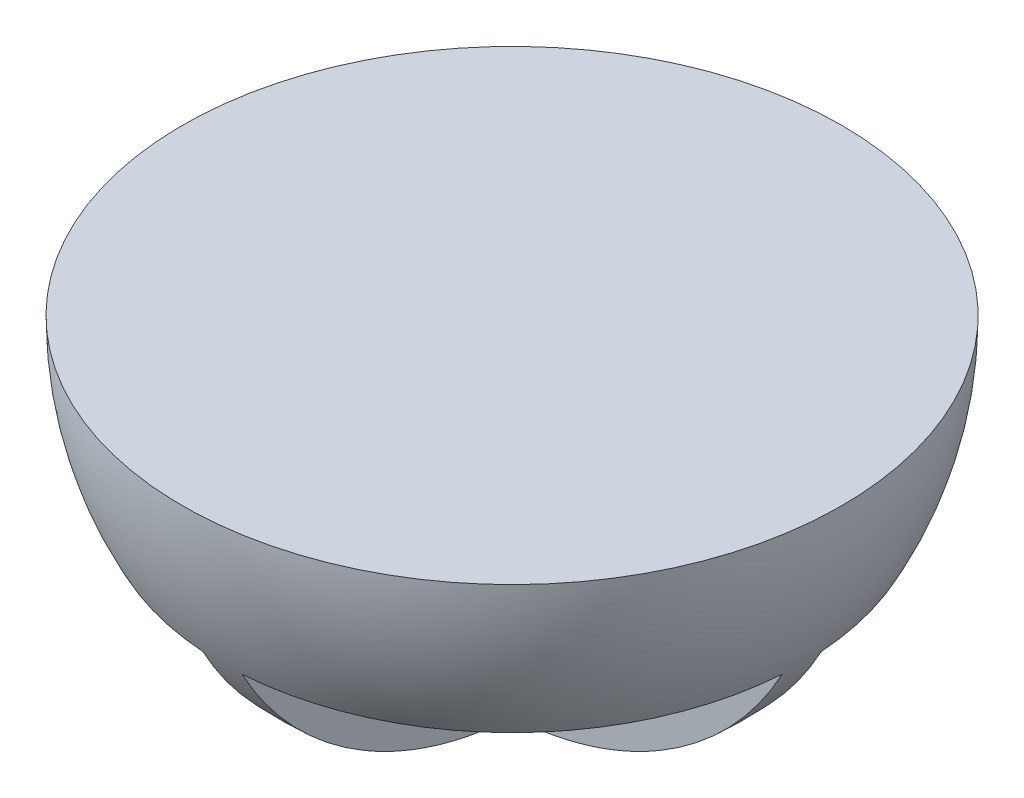
ISO-10303-21;
HEADER;
FILE_DESCRIPTION(('STEP AP214'),'2;1');
FILE_NAME('part.step','',(''),(''),'','','');
FILE_SCHEMA(('AUTOMOTIVE_DESIGN { 1 0 10303 214 1 1 1 1 }'));
ENDSEC;
DATA;
#1=APPLICATION_CONTEXT('core data for automotive mechanical design processes');
#2=APPLICATION_PROTOCOL_DEFINITION('international standard','automotive_design',2000,#1);
#3=PRODUCT_CONTEXT('',#1,'mechanical');
#4=PRODUCT('Part','Part','',(#3));
#5=PRODUCT_RELATED_PRODUCT_CATEGORY('part','',(#4));
#6=PRODUCT_DEFINITION_FORMATION('','',#4);
#7=PRODUCT_DEFINITION_CONTEXT('part definition',#1,'design');
#8=PRODUCT_DEFINITION('design','',#6,#7);
#9=PRODUCT_DEFINITION_SHAPE('','',#8);
#10=(LENGTH_UNIT() NAMED_UNIT(*) SI_UNIT(.MILLI.,.METRE.));
#11=(NAMED_UNIT(*) PLANE_ANGLE_UNIT() SI_UNIT($,.RADIAN.));
#12=(NAMED_UNIT(*) SI_UNIT($,.STERADIAN.) SOLID_ANGLE_UNIT());
#13=UNCERTAINTY_MEASURE_WITH_UNIT(LENGTH_MEASURE(1.E-05),#10,'distance_accuracy_value','');
#14=(GEOMETRIC_REPRESENTATION_CONTEXT(3) GLOBAL_UNCERTAINTY_ASSIGNED_CONTEXT((#13)) GLOBAL_UNIT_ASSIGNED_CONTEXT((#10,
#11,#12)) REPRESENTATION_CONTEXT('',''));
#15=CARTESIAN_POINT('',(0.,0.,0.));
#16=DIRECTION('',(0.,0.,1.));
#17=DIRECTION('',(1.,0.,0.));
#18=AXIS2_PLACEMENT_3D('',#15,#16,#17);
#19=CARTESIAN_POINT('',(0.,0.,0.));
#20=DIRECTION('',(0.,-1.,0.));
#21=DIRECTION('',(-1.,0.,0.));
#22=AXIS2_PLACEMENT_3D('',#19,#20,#21);
#23=SPHERICAL_SURFACE('',#22,33.8);
#24=CARTESIAN_POINT('',(0.,-33.791677969583,0.));
#25=DIRECTION('',(0.,1.,0.));
#26=DIRECTION('',(0.,0.,1.));
#27=AXIS2_PLACEMENT_3D('',#24,#25,#26);
#28=CIRCLE('',#27,0.75);
#29=CARTESIAN_POINT('',(0.,-33.791677969583,0.75));
#30=VERTEX_POINT('',#29);
#31=EDGE_CURVE('E158',#30,#30,#28,.T.);
#32=ORIENTED_EDGE('',*,*,#31,.T.);
#33=EDGE_LOOP('',(#32));
#34=FACE_BOUND('',#33,.T.);
#35=CARTESIAN_POINT('',(2.,0.,0.));
#36=DIRECTION('',(-1.,0.,0.));
#37=DIRECTION('',(0.,0.,1.));
#38=AXIS2_PLACEMENT_3D('',#35,#36,#37);
#39=CIRCLE('',#38,33.7407765174425);
#40=CARTESIAN_POINT('',(2.,-16.,-29.7058916715186));
#41=VERTEX_POINT('',#40);
#42=CARTESIAN_POINT('',(2.,-33.6814488999508,-2.));
#43=VERTEX_POINT('',#42);
#44=EDGE_CURVE('E123',#41,#43,#39,.T.);
#45=ORIENTED_EDGE('',*,*,#44,.T.);
#46=CARTESIAN_POINT('',(0.,0.,-2.));
#47=DIRECTION('',(0.,0.,1.));
#48=DIRECTION('',(1.,0.,0.));
#49=AXIS2_PLACEMENT_3D('',#46,#47,#48);
#50=CIRCLE('',#49,33.7407765174425);
#51=CARTESIAN_POINT('',(29.7058916715186,-16.,-2.));
#52=VERTEX_POINT('',#51);
#53=EDGE_CURVE('E119',#43,#52,#50,.T.);
#54=ORIENTED_EDGE('',*,*,#53,.T.);
#55=CARTESIAN_POINT('',(0.,-16.,0.));
#56=DIRECTION('',(0.,1.,0.));
#57=DIRECTION('',(0.,0.,1.));
#58=AXIS2_PLACEMENT_3D('',#55,#56,#57);
#59=CIRCLE('',#58,29.7731422594257);
#60=EDGE_CURVE('E104',#52,#41,#59,.T.);
#61=ORIENTED_EDGE('',*,*,#60,.T.);
#62=EDGE_LOOP('',(#45,#54,#61));
#63=FACE_BOUND('',#62,.T.);
#64=CARTESIAN_POINT('',(0.,0.,0.));
#65=DIRECTION('',(0.,-1.,0.));
#66=DIRECTION('',(0.,0.,-1.));
#67=AXIS2_PLACEMENT_3D('',#64,#65,#66);
#68=CIRCLE('',#67,33.8);
#69=CARTESIAN_POINT('',(0.,0.,-33.8));
#70=VERTEX_POINT('',#69);
#71=EDGE_CURVE('E11',#70,#70,#68,.T.);
#72=ORIENTED_EDGE('',*,*,#71,.T.);
#73=EDGE_LOOP('',(#72));
#74=FACE_BOUND('',#73,.T.);
#75=CARTESIAN_POINT('',(0.,0.,-2.));
#76=DIRECTION('',(0.,0.,1.));
#77=DIRECTION('',(1.,0.,0.));
#78=AXIS2_PLACEMENT_3D('',#75,#76,#77);
#79=CIRCLE('',#78,33.7407765174425);
#80=CARTESIAN_POINT('',(-29.7058916715186,-16.,-2.));
#81=VERTEX_POINT('',#80);
#82=CARTESIAN_POINT('',(-2.,-33.6814488999508,-2.));
#83=VERTEX_POINT('',#82);
#84=EDGE_CURVE('E114',#81,#83,#79,.T.);
#85=ORIENTED_EDGE('',*,*,#84,.T.);
#86=CARTESIAN_POINT('',(-2.,0.,0.));
#87=DIRECTION('',(-1.,0.,0.));
#88=DIRECTION('',(0.,0.,1.));
#89=AXIS2_PLACEMENT_3D('',#86,#87,#88);
#90=CIRCLE('',#89,33.7407765174425);
#91=CARTESIAN_POINT('',(-2.,-16.,-29.7058916715186));
#92=VERTEX_POINT('',#91);
#93=EDGE_CURVE('E163',#92,#83,#90,.T.);
#94=ORIENTED_EDGE('',*,*,#93,.F.);
#95=CARTESIAN_POINT('',(0.,-16.,0.));
#96=DIRECTION('',(0.,1.,0.));
#97=DIRECTION('',(0.,0.,1.));
#98=AXIS2_PLACEMENT_3D('',#95,#96,#97);
#99=CIRCLE('',#98,29.7731422594257);
#100=EDGE_CURVE('E45',#92,#81,#99,.T.);
#101=ORIENTED_EDGE('',*,*,#100,.T.);
#102=EDGE_LOOP('',(#85,#94,#101));
#103=FACE_BOUND('',#102,.T.);
#104=CARTESIAN_POINT('',(0.,-16.,0.));
#105=DIRECTION('',(0.,1.,0.));
#106=DIRECTION('',(0.,0.,1.));
#107=AXIS2_PLACEMENT_3D('',#104,#105,#106);
#108=CIRCLE('',#107,29.7731422594257);
#109=CARTESIAN_POINT('',(2.,-16.,29.7058916715186));
#110=VERTEX_POINT('',#109);
#111=CARTESIAN_POINT('',(29.7058916715186,-16.,2.));
#112=VERTEX_POINT('',#111);
#113=EDGE_CURVE('E124',#110,#112,#108,.T.);
#114=ORIENTED_EDGE('',*,*,#113,.T.);
#115=CARTESIAN_POINT('',(0.,0.,2.));
#116=DIRECTION('',(0.,0.,1.));
#117=DIRECTION('',(1.,0.,0.));
#118=AXIS2_PLACEMENT_3D('',#115,#116,#117);
#119=CIRCLE('',#118,33.7407765174425);
#120=CARTESIAN_POINT('',(2.,-33.6814488999508,2.));
#121=VERTEX_POINT('',#120);
#122=EDGE_CURVE('E136',#121,#112,#119,.T.);
#123=ORIENTED_EDGE('',*,*,#122,.F.);
#124=CARTESIAN_POINT('',(2.,0.,0.));
#125=DIRECTION('',(-1.,0.,0.));
#126=DIRECTION('',(0.,0.,1.));
#127=AXIS2_PLACEMENT_3D('',#124,#125,#126);
#128=CIRCLE('',#127,33.7407765174425);
#129=EDGE_CURVE('E133',#121,#110,#128,.T.);
#130=ORIENTED_EDGE('',*,*,#129,.T.);
#131=EDGE_LOOP('',(#114,#123,#130));
#132=FACE_BOUND('',#131,.T.);
#133=CARTESIAN_POINT('',(-2.,0.,0.));
#134=DIRECTION('',(-1.,0.,0.));
#135=DIRECTION('',(0.,0.,1.));
#136=AXIS2_PLACEMENT_3D('',#133,#134,#135);
#137=CIRCLE('',#136,33.7407765174425);
#138=CARTESIAN_POINT('',(-2.,-33.6814488999508,2.));
#139=VERTEX_POINT('',#138);
#140=CARTESIAN_POINT('',(-2.,-16.,29.7058916715186));
#141=VERTEX_POINT('',#140);
#142=EDGE_CURVE('E144',#139,#141,#137,.T.);
#143=ORIENTED_EDGE('',*,*,#142,.F.);
#144=CARTESIAN_POINT('',(0.,0.,2.));
#145=DIRECTION('',(0.,0.,1.));
#146=DIRECTION('',(1.,0.,0.));
#147=AXIS2_PLACEMENT_3D('',#144,#145,#146);
#148=CIRCLE('',#147,33.7407765174425);
#149=CARTESIAN_POINT('',(-29.7058916715186,-16.,2.));
#150=VERTEX_POINT('',#149);
#151=EDGE_CURVE('E146',#150,#139,#148,.T.);
#152=ORIENTED_EDGE('',*,*,#151,.F.);
#153=CARTESIAN_POINT('',(0.,-16.,0.));
#154=DIRECTION('',(0.,1.,0.));
#155=DIRECTION('',(0.,0.,1.));
#156=AXIS2_PLACEMENT_3D('',#153,#154,#155);
#157=CIRCLE('',#156,29.7731422594257);
#158=EDGE_CURVE('E137',#150,#141,#157,.T.);
#159=ORIENTED_EDGE('',*,*,#158,.T.);
#160=EDGE_LOOP('',(#143,#152,#159));
#161=FACE_BOUND('',#160,.T.);
#162=ADVANCED_FACE('F37',(#34,#63,#74,#103,#132,#161),#23,.T.);
#163=CARTESIAN_POINT('',(33.8,0.,0.));
#164=DIRECTION('',(0.,1.,0.));
#165=DIRECTION('',(0.,0.,1.));
#166=AXIS2_PLACEMENT_3D('',#163,#164,#165);
#167=PLANE('',#166);
#168=ORIENTED_EDGE('',*,*,#71,.F.);
#169=EDGE_LOOP('',(#168));
#170=FACE_BOUND('',#169,.T.);
#171=ADVANCED_FACE('F39',(#170),#167,.T.);
#172=CARTESIAN_POINT('',(-2.,-33.801,0.));
#173=DIRECTION('',(-1.,0.,0.));
#174=DIRECTION('',(0.,0.,1.));
#175=AXIS2_PLACEMENT_3D('',#172,#173,#174);
#176=PLANE('',#175);
#177=ORIENTED_EDGE('',*,*,#93,.T.);
#178=DIRECTION('',(0.,1.,0.));
#179=VECTOR('',#178,1.);
#180=CARTESIAN_POINT('',(-2.,-33.801,-2.));
#181=LINE('',#180,#179);
#182=CARTESIAN_POINT('',(-2.,-16.,-2.));
#183=VERTEX_POINT('',#182);
#184=EDGE_CURVE('E171',#83,#183,#181,.T.);
#185=ORIENTED_EDGE('',*,*,#184,.T.);
#186=DIRECTION('',(0.,0.,1.));
#187=VECTOR('',#186,1.);
#188=CARTESIAN_POINT('',(-2.,-16.,0.));
#189=LINE('',#188,#187);
#190=EDGE_CURVE('E168',#92,#183,#189,.T.);
#191=ORIENTED_EDGE('',*,*,#190,.F.);
#192=EDGE_LOOP('',(#177,#185,#191));
#193=FACE_BOUND('',#192,.T.);
#194=ADVANCED_FACE('F181',(#193),#176,.T.);
#195=CARTESIAN_POINT('',(0.,-33.801,-2.));
#196=DIRECTION('',(0.,0.,1.));
#197=DIRECTION('',(1.,0.,0.));
#198=AXIS2_PLACEMENT_3D('',#195,#196,#197);
#199=PLANE('',#198);
#200=DIRECTION('',(1.,0.,0.));
#201=VECTOR('',#200,1.);
#202=CARTESIAN_POINT('',(0.,-16.,-2.));
#203=LINE('',#202,#201);
#204=EDGE_CURVE('E165',#81,#183,#203,.T.);
#205=ORIENTED_EDGE('',*,*,#204,.T.);
#206=ORIENTED_EDGE('',*,*,#184,.F.);
#207=ORIENTED_EDGE('',*,*,#84,.F.);
#208=EDGE_LOOP('',(#205,#206,#207));
#209=FACE_BOUND('',#208,.T.);
#210=ADVANCED_FACE('F184',(#209),#199,.F.);
#211=CARTESIAN_POINT('',(0.,-16.,0.));
#212=DIRECTION('',(0.,1.,0.));
#213=DIRECTION('',(0.,0.,1.));
#214=AXIS2_PLACEMENT_3D('',#211,#212,#213);
#215=PLANE('',#214);
#216=ORIENTED_EDGE('',*,*,#190,.T.);
#217=ORIENTED_EDGE('',*,*,#204,.F.);
#218=ORIENTED_EDGE('',*,*,#100,.F.);
#219=EDGE_LOOP('',(#216,#217,#218));
#220=FACE_BOUND('',#219,.T.);
#221=ADVANCED_FACE('F179',(#220),#215,.F.);
#222=CARTESIAN_POINT('',(2.,-33.801,0.));
#223=DIRECTION('',(-1.,0.,0.));
#224=DIRECTION('',(0.,0.,1.));
#225=AXIS2_PLACEMENT_3D('',#222,#223,#224);
#226=PLANE('',#225);
#227=DIRECTION('',(0.,0.,1.));
#228=VECTOR('',#227,1.);
#229=CARTESIAN_POINT('',(2.,-16.,0.));
#230=LINE('',#229,#228);
#231=CARTESIAN_POINT('',(2.,-16.,-2.));
#232=VERTEX_POINT('',#231);
#233=EDGE_CURVE('E109',#41,#232,#230,.T.);
#234=ORIENTED_EDGE('',*,*,#233,.T.);
#235=DIRECTION('',(0.,1.,0.));
#236=VECTOR('',#235,1.);
#237=CARTESIAN_POINT('',(2.,-33.801,-2.));
#238=LINE('',#237,#236);
#239=EDGE_CURVE('E115',#43,#232,#238,.T.);
#240=ORIENTED_EDGE('',*,*,#239,.F.);
#241=ORIENTED_EDGE('',*,*,#44,.F.);
#242=EDGE_LOOP('',(#234,#240,#241));
#243=FACE_BOUND('',#242,.T.);
#244=ADVANCED_FACE('F191',(#243),#226,.F.);
#245=CARTESIAN_POINT('',(0.,-33.801,-2.));
#246=DIRECTION('',(0.,0.,1.));
#247=DIRECTION('',(1.,0.,0.));
#248=AXIS2_PLACEMENT_3D('',#245,#246,#247);
#249=PLANE('',#248);
#250=ORIENTED_EDGE('',*,*,#239,.T.);
#251=DIRECTION('',(1.,0.,0.));
#252=VECTOR('',#251,1.);
#253=CARTESIAN_POINT('',(0.,-16.,-2.));
#254=LINE('',#253,#252);
#255=EDGE_CURVE('E107',#232,#52,#254,.T.);
#256=ORIENTED_EDGE('',*,*,#255,.T.);
#257=ORIENTED_EDGE('',*,*,#53,.F.);
#258=EDGE_LOOP('',(#250,#256,#257));
#259=FACE_BOUND('',#258,.T.);
#260=ADVANCED_FACE('F118',(#259),#249,.F.);
#261=CARTESIAN_POINT('',(0.,-16.,0.));
#262=DIRECTION('',(0.,1.,0.));
#263=DIRECTION('',(0.,0.,1.));
#264=AXIS2_PLACEMENT_3D('',#261,#262,#263);
#265=PLANE('',#264);
#266=ORIENTED_EDGE('',*,*,#255,.F.);
#267=ORIENTED_EDGE('',*,*,#233,.F.);
#268=ORIENTED_EDGE('',*,*,#60,.F.);
#269=EDGE_LOOP('',(#266,#267,#268));
#270=FACE_BOUND('',#269,.T.);
#271=ADVANCED_FACE('F106',(#270),#265,.F.);
#272=CARTESIAN_POINT('',(0.,-33.801,2.));
#273=DIRECTION('',(0.,0.,1.));
#274=DIRECTION('',(1.,0.,0.));
#275=AXIS2_PLACEMENT_3D('',#272,#273,#274);
#276=PLANE('',#275);
#277=ORIENTED_EDGE('',*,*,#122,.T.);
#278=DIRECTION('',(1.,0.,0.));
#279=VECTOR('',#278,1.);
#280=CARTESIAN_POINT('',(0.,-16.,2.));
#281=LINE('',#280,#279);
#282=CARTESIAN_POINT('',(2.,-16.,2.));
#283=VERTEX_POINT('',#282);
#284=EDGE_CURVE('E60',#283,#112,#281,.T.);
#285=ORIENTED_EDGE('',*,*,#284,.F.);
#286=DIRECTION('',(0.,1.,0.));
#287=VECTOR('',#286,1.);
#288=CARTESIAN_POINT('',(2.,-33.801,2.));
#289=LINE('',#288,#287);
#290=EDGE_CURVE('E128',#121,#283,#289,.T.);
#291=ORIENTED_EDGE('',*,*,#290,.F.);
#292=EDGE_LOOP('',(#277,#285,#291));
#293=FACE_BOUND('',#292,.T.);
#294=ADVANCED_FACE('F226',(#293),#276,.T.);
#295=CARTESIAN_POINT('',(2.,-33.801,0.));
#296=DIRECTION('',(-1.,0.,0.));
#297=DIRECTION('',(0.,0.,1.));
#298=AXIS2_PLACEMENT_3D('',#295,#296,#297);
#299=PLANE('',#298);
#300=ORIENTED_EDGE('',*,*,#290,.T.);
#301=DIRECTION('',(0.,0.,1.));
#302=VECTOR('',#301,1.);
#303=CARTESIAN_POINT('',(2.,-16.,0.));
#304=LINE('',#303,#302);
#305=EDGE_CURVE('E140',#283,#110,#304,.T.);
#306=ORIENTED_EDGE('',*,*,#305,.T.);
#307=ORIENTED_EDGE('',*,*,#129,.F.);
#308=EDGE_LOOP('',(#300,#306,#307));
#309=FACE_BOUND('',#308,.T.);
#310=ADVANCED_FACE('F229',(#309),#299,.F.);
#311=CARTESIAN_POINT('',(0.,-16.,0.));
#312=DIRECTION('',(0.,1.,0.));
#313=DIRECTION('',(0.,0.,1.));
#314=AXIS2_PLACEMENT_3D('',#311,#312,#313);
#315=PLANE('',#314);
#316=ORIENTED_EDGE('',*,*,#305,.F.);
#317=ORIENTED_EDGE('',*,*,#284,.T.);
#318=ORIENTED_EDGE('',*,*,#113,.F.);
#319=EDGE_LOOP('',(#316,#317,#318));
#320=FACE_BOUND('',#319,.T.);
#321=ADVANCED_FACE('F219',(#320),#315,.F.);
#322=CARTESIAN_POINT('',(0.,-33.801,2.));
#323=DIRECTION('',(0.,0.,1.));
#324=DIRECTION('',(1.,0.,0.));
#325=AXIS2_PLACEMENT_3D('',#322,#323,#324);
#326=PLANE('',#325);
#327=ORIENTED_EDGE('',*,*,#151,.T.);
#328=DIRECTION('',(0.,1.,0.));
#329=VECTOR('',#328,1.);
#330=CARTESIAN_POINT('',(-2.,-33.801,2.));
#331=LINE('',#330,#329);
#332=CARTESIAN_POINT('',(-2.,-16.,2.));
#333=VERTEX_POINT('',#332);
#334=EDGE_CURVE('E152',#139,#333,#331,.T.);
#335=ORIENTED_EDGE('',*,*,#334,.T.);
#336=DIRECTION('',(1.,0.,0.));
#337=VECTOR('',#336,1.);
#338=CARTESIAN_POINT('',(0.,-16.,2.));
#339=LINE('',#338,#337);
#340=EDGE_CURVE('E149',#150,#333,#339,.T.);
#341=ORIENTED_EDGE('',*,*,#340,.F.);
#342=EDGE_LOOP('',(#327,#335,#341));
#343=FACE_BOUND('',#342,.T.);
#344=ADVANCED_FACE('F215',(#343),#326,.T.);
#345=CARTESIAN_POINT('',(-2.,-33.801,0.));
#346=DIRECTION('',(-1.,0.,0.));
#347=DIRECTION('',(0.,0.,1.));
#348=AXIS2_PLACEMENT_3D('',#345,#346,#347);
#349=PLANE('',#348);
#350=ORIENTED_EDGE('',*,*,#142,.T.);
#351=DIRECTION('',(0.,0.,1.));
#352=VECTOR('',#351,1.);
#353=CARTESIAN_POINT('',(-2.,-16.,0.));
#354=LINE('',#353,#352);
#355=EDGE_CURVE('E52',#333,#141,#354,.T.);
#356=ORIENTED_EDGE('',*,*,#355,.F.);
#357=ORIENTED_EDGE('',*,*,#334,.F.);
#358=EDGE_LOOP('',(#350,#356,#357));
#359=FACE_BOUND('',#358,.T.);
#360=ADVANCED_FACE('F218',(#359),#349,.T.);
#361=CARTESIAN_POINT('',(0.,-16.,0.));
#362=DIRECTION('',(0.,1.,0.));
#363=DIRECTION('',(0.,0.,1.));
#364=AXIS2_PLACEMENT_3D('',#361,#362,#363);
#365=PLANE('',#364);
#366=ORIENTED_EDGE('',*,*,#340,.T.);
#367=ORIENTED_EDGE('',*,*,#355,.T.);
#368=ORIENTED_EDGE('',*,*,#158,.F.);
#369=EDGE_LOOP('',(#366,#367,#368));
#370=FACE_BOUND('',#369,.T.);
#371=ADVANCED_FACE('F206',(#370),#365,.F.);
#372=CARTESIAN_POINT('',(0.,-33.801,0.));
#373=DIRECTION('',(0.,1.,0.));
#374=DIRECTION('',(0.,0.,1.));
#375=AXIS2_PLACEMENT_3D('',#372,#373,#374);
#376=CYLINDRICAL_SURFACE('',#375,0.75);
#377=ORIENTED_EDGE('',*,*,#31,.F.);
#378=EDGE_LOOP('',(#377));
#379=FACE_BOUND('',#378,.T.);
#380=CARTESIAN_POINT('',(0.,-16.,0.));
#381=DIRECTION('',(0.,1.,0.));
#382=DIRECTION('',(0.,0.,1.));
#383=AXIS2_PLACEMENT_3D('',#380,#381,#382);
#384=CIRCLE('',#383,0.75);
#385=CARTESIAN_POINT('',(0.,-16.,0.75));
#386=VERTEX_POINT('',#385);
#387=EDGE_CURVE('E147',#386,#386,#384,.T.);
#388=ORIENTED_EDGE('',*,*,#387,.T.);
#389=EDGE_LOOP('',(#388));
#390=FACE_BOUND('',#389,.T.);
#391=ADVANCED_FACE('F202',(#379,#390),#376,.F.);
#392=CARTESIAN_POINT('',(0.,-16.,0.));
#393=DIRECTION('',(0.,1.,0.));
#394=DIRECTION('',(0.,0.,1.));
#395=AXIS2_PLACEMENT_3D('',#392,#393,#394);
#396=PLANE('',#395);
#397=ORIENTED_EDGE('',*,*,#387,.F.);
#398=EDGE_LOOP('',(#397));
#399=FACE_BOUND('',#398,.T.);
#400=ADVANCED_FACE('F205',(#399),#396,.F.);
#401=CLOSED_SHELL('',(#162,#171,#194,#210,#221,#244,#260,#271,#294,#310,#321,#344,#360,#371,
#391,#400));
#402=MANIFOLD_SOLID_BREP('B2',#401);
#403=ADVANCED_BREP_SHAPE_REPRESENTATION('',(#18,#402),#14);
#404=SHAPE_DEFINITION_REPRESENTATION(#9,#403);
ENDSEC;
END-ISO-10303-21;
